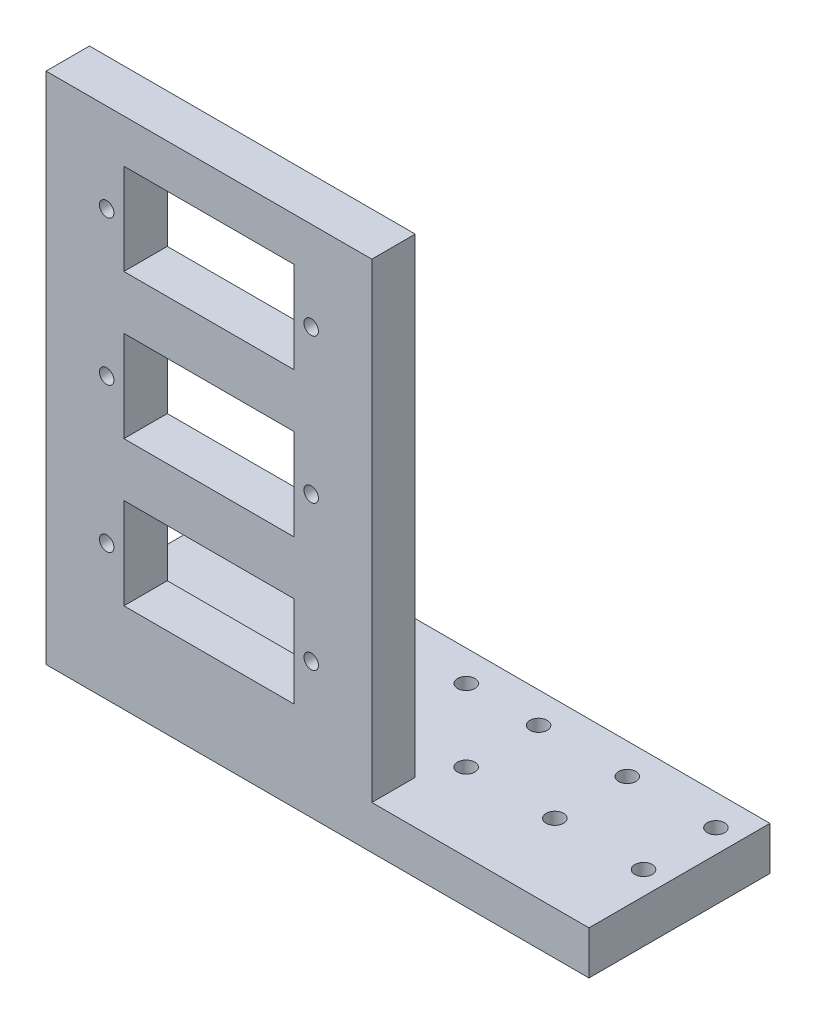
ISO-10303-21;
HEADER;
FILE_DESCRIPTION(('STEP AP214'),'2;1');
FILE_NAME('part.step','',(''),(''),'','','');
FILE_SCHEMA(('AUTOMOTIVE_DESIGN { 1 0 10303 214 1 1 1 1 }'));
ENDSEC;
DATA;
#1=APPLICATION_CONTEXT('core data for automotive mechanical design processes');
#2=APPLICATION_PROTOCOL_DEFINITION('international standard','automotive_design',2000,#1);
#3=PRODUCT_CONTEXT('',#1,'mechanical');
#4=PRODUCT('Part','Part','',(#3));
#5=PRODUCT_RELATED_PRODUCT_CATEGORY('part','',(#4));
#6=PRODUCT_DEFINITION_FORMATION('','',#4);
#7=PRODUCT_DEFINITION_CONTEXT('part definition',#1,'design');
#8=PRODUCT_DEFINITION('design','',#6,#7);
#9=PRODUCT_DEFINITION_SHAPE('','',#8);
#10=(LENGTH_UNIT() NAMED_UNIT(*) SI_UNIT(.MILLI.,.METRE.));
#11=(NAMED_UNIT(*) PLANE_ANGLE_UNIT() SI_UNIT($,.RADIAN.));
#12=(NAMED_UNIT(*) SI_UNIT($,.STERADIAN.) SOLID_ANGLE_UNIT());
#13=UNCERTAINTY_MEASURE_WITH_UNIT(LENGTH_MEASURE(1.E-05),#10,'distance_accuracy_value','');
#14=(GEOMETRIC_REPRESENTATION_CONTEXT(3) GLOBAL_UNCERTAINTY_ASSIGNED_CONTEXT((#13)) GLOBAL_UNIT_ASSIGNED_CONTEXT((#10,
#11,#12)) REPRESENTATION_CONTEXT('',''));
#15=CARTESIAN_POINT('',(0.,0.,0.));
#16=DIRECTION('',(0.,0.,1.));
#17=DIRECTION('',(1.,0.,0.));
#18=AXIS2_PLACEMENT_3D('',#15,#16,#17);
#19=CARTESIAN_POINT('',(45.,65.,0.));
#20=DIRECTION('',(-1.,0.,0.));
#21=DIRECTION('',(0.,0.,1.));
#22=AXIS2_PLACEMENT_3D('',#19,#20,#21);
#23=PLANE('',#22);
#24=DIRECTION('',(0.,0.,1.));
#25=VECTOR('',#24,1.);
#26=CARTESIAN_POINT('',(45.,0.,-25.));
#27=LINE('',#26,#25);
#28=CARTESIAN_POINT('',(45.,0.,-6.));
#29=VERTEX_POINT('',#28);
#30=CARTESIAN_POINT('',(45.,0.,0.));
#31=VERTEX_POINT('',#30);
#32=EDGE_CURVE('E11',#29,#31,#27,.T.);
#33=ORIENTED_EDGE('',*,*,#32,.F.);
#34=DIRECTION('',(0.,-1.,0.));
#35=VECTOR('',#34,1.);
#36=CARTESIAN_POINT('',(45.,65.,-6.));
#37=LINE('',#36,#35);
#38=CARTESIAN_POINT('',(45.,65.,-6.));
#39=VERTEX_POINT('',#38);
#40=EDGE_CURVE('E374',#39,#29,#37,.T.);
#41=ORIENTED_EDGE('',*,*,#40,.F.);
#42=DIRECTION('',(0.,0.,-1.));
#43=VECTOR('',#42,1.);
#44=CARTESIAN_POINT('',(45.,65.,0.));
#45=LINE('',#44,#43);
#46=CARTESIAN_POINT('',(45.,65.,0.));
#47=VERTEX_POINT('',#46);
#48=EDGE_CURVE('E361',#47,#39,#45,.T.);
#49=ORIENTED_EDGE('',*,*,#48,.F.);
#50=DIRECTION('',(0.,-1.,0.));
#51=VECTOR('',#50,1.);
#52=CARTESIAN_POINT('',(45.,65.,0.));
#53=LINE('',#52,#51);
#54=EDGE_CURVE('E378',#47,#31,#53,.T.);
#55=ORIENTED_EDGE('',*,*,#54,.T.);
#56=EDGE_LOOP('',(#33,#41,#49,#55));
#57=FACE_BOUND('',#56,.T.);
#58=ADVANCED_FACE('F40',(#57),#23,.F.);
#59=CARTESIAN_POINT('',(8.375,12.7,-6.));
#60=DIRECTION('',(0.,0.,1.));
#61=DIRECTION('',(1.,0.,0.));
#62=AXIS2_PLACEMENT_3D('',#59,#60,#61);
#63=CYLINDRICAL_SURFACE('',#62,1.);
#64=CARTESIAN_POINT('',(8.375,12.7,-6.));
#65=DIRECTION('',(0.,0.,1.));
#66=DIRECTION('',(1.,0.,0.));
#67=AXIS2_PLACEMENT_3D('',#64,#65,#66);
#68=CIRCLE('',#67,1.);
#69=CARTESIAN_POINT('',(9.375,12.7,-6.));
#70=VERTEX_POINT('',#69);
#71=EDGE_CURVE('E432',#70,#70,#68,.T.);
#72=ORIENTED_EDGE('',*,*,#71,.F.);
#73=EDGE_LOOP('',(#72));
#74=FACE_BOUND('',#73,.T.);
#75=CARTESIAN_POINT('',(8.375,12.7,0.));
#76=DIRECTION('',(0.,0.,1.));
#77=DIRECTION('',(1.,0.,0.));
#78=AXIS2_PLACEMENT_3D('',#75,#76,#77);
#79=CIRCLE('',#78,1.);
#80=CARTESIAN_POINT('',(9.375,12.7,0.));
#81=VERTEX_POINT('',#80);
#82=EDGE_CURVE('E50',#81,#81,#79,.T.);
#83=ORIENTED_EDGE('',*,*,#82,.T.);
#84=EDGE_LOOP('',(#83));
#85=FACE_BOUND('',#84,.T.);
#86=ADVANCED_FACE('F42',(#74,#85),#63,.F.);
#87=CARTESIAN_POINT('',(10.75,6.4,-6.));
#88=DIRECTION('',(0.,-1.,0.));
#89=DIRECTION('',(0.,0.,-1.));
#90=AXIS2_PLACEMENT_3D('',#87,#88,#89);
#91=PLANE('',#90);
#92=DIRECTION('',(1.,0.,0.));
#93=VECTOR('',#92,1.);
#94=CARTESIAN_POINT('',(10.75,6.4,0.));
#95=LINE('',#94,#93);
#96=CARTESIAN_POINT('',(10.75,6.4,0.));
#97=VERTEX_POINT('',#96);
#98=CARTESIAN_POINT('',(34.25,6.4,0.));
#99=VERTEX_POINT('',#98);
#100=EDGE_CURVE('E403',#97,#99,#95,.T.);
#101=ORIENTED_EDGE('',*,*,#100,.T.);
#102=DIRECTION('',(0.,0.,1.));
#103=VECTOR('',#102,1.);
#104=CARTESIAN_POINT('',(34.25,6.4,-6.));
#105=LINE('',#104,#103);
#106=CARTESIAN_POINT('',(34.25,6.4,-6.));
#107=VERTEX_POINT('',#106);
#108=EDGE_CURVE('E428',#107,#99,#105,.T.);
#109=ORIENTED_EDGE('',*,*,#108,.F.);
#110=DIRECTION('',(1.,0.,0.));
#111=VECTOR('',#110,1.);
#112=CARTESIAN_POINT('',(10.75,6.4,-6.));
#113=LINE('',#112,#111);
#114=CARTESIAN_POINT('',(10.75,6.4,-6.));
#115=VERTEX_POINT('',#114);
#116=EDGE_CURVE('E409',#115,#107,#113,.T.);
#117=ORIENTED_EDGE('',*,*,#116,.F.);
#118=DIRECTION('',(0.,0.,1.));
#119=VECTOR('',#118,1.);
#120=CARTESIAN_POINT('',(10.75,6.4,-6.));
#121=LINE('',#120,#119);
#122=EDGE_CURVE('E417',#115,#97,#121,.T.);
#123=ORIENTED_EDGE('',*,*,#122,.T.);
#124=EDGE_LOOP('',(#101,#109,#117,#123));
#125=FACE_BOUND('',#124,.T.);
#126=ADVANCED_FACE('F491',(#125),#91,.F.);
#127=CARTESIAN_POINT('',(34.25,19.,-6.));
#128=DIRECTION('',(1.,0.,0.));
#129=DIRECTION('',(0.,1.,0.));
#130=AXIS2_PLACEMENT_3D('',#127,#128,#129);
#131=PLANE('',#130);
#132=DIRECTION('',(0.,1.,0.));
#133=VECTOR('',#132,1.);
#134=CARTESIAN_POINT('',(34.25,19.,0.));
#135=LINE('',#134,#133);
#136=CARTESIAN_POINT('',(34.25,19.,0.));
#137=VERTEX_POINT('',#136);
#138=EDGE_CURVE('E399',#99,#137,#135,.T.);
#139=ORIENTED_EDGE('',*,*,#138,.T.);
#140=DIRECTION('',(0.,0.,1.));
#141=VECTOR('',#140,1.);
#142=CARTESIAN_POINT('',(34.25,19.,-6.));
#143=LINE('',#142,#141);
#144=CARTESIAN_POINT('',(34.25,19.,-6.));
#145=VERTEX_POINT('',#144);
#146=EDGE_CURVE('E424',#145,#137,#143,.T.);
#147=ORIENTED_EDGE('',*,*,#146,.F.);
#148=DIRECTION('',(0.,1.,0.));
#149=VECTOR('',#148,1.);
#150=CARTESIAN_POINT('',(34.25,19.,-6.));
#151=LINE('',#150,#149);
#152=EDGE_CURVE('E65',#107,#145,#151,.T.);
#153=ORIENTED_EDGE('',*,*,#152,.F.);
#154=ORIENTED_EDGE('',*,*,#108,.T.);
#155=EDGE_LOOP('',(#139,#147,#153,#154));
#156=FACE_BOUND('',#155,.T.);
#157=ADVANCED_FACE('F515',(#156),#131,.F.);
#158=CARTESIAN_POINT('',(10.75,19.,-6.));
#159=DIRECTION('',(0.,1.,0.));
#160=DIRECTION('',(0.,0.,1.));
#161=AXIS2_PLACEMENT_3D('',#158,#159,#160);
#162=PLANE('',#161);
#163=DIRECTION('',(-1.,0.,0.));
#164=VECTOR('',#163,1.);
#165=CARTESIAN_POINT('',(10.75,19.,0.));
#166=LINE('',#165,#164);
#167=CARTESIAN_POINT('',(10.75,19.,0.));
#168=VERTEX_POINT('',#167);
#169=EDGE_CURVE('E395',#137,#168,#166,.T.);
#170=ORIENTED_EDGE('',*,*,#169,.T.);
#171=DIRECTION('',(0.,0.,1.));
#172=VECTOR('',#171,1.);
#173=CARTESIAN_POINT('',(10.75,19.,-6.));
#174=LINE('',#173,#172);
#175=CARTESIAN_POINT('',(10.75,19.,-6.));
#176=VERTEX_POINT('',#175);
#177=EDGE_CURVE('E421',#176,#168,#174,.T.);
#178=ORIENTED_EDGE('',*,*,#177,.F.);
#179=DIRECTION('',(-1.,0.,0.));
#180=VECTOR('',#179,1.);
#181=CARTESIAN_POINT('',(10.75,19.,-6.));
#182=LINE('',#181,#180);
#183=EDGE_CURVE('E414',#145,#176,#182,.T.);
#184=ORIENTED_EDGE('',*,*,#183,.F.);
#185=ORIENTED_EDGE('',*,*,#146,.T.);
#186=EDGE_LOOP('',(#170,#178,#184,#185));
#187=FACE_BOUND('',#186,.T.);
#188=ADVANCED_FACE('F512',(#187),#162,.F.);
#189=CARTESIAN_POINT('',(10.75,19.,-6.));
#190=DIRECTION('',(-1.,0.,0.));
#191=DIRECTION('',(0.,-1.,0.));
#192=AXIS2_PLACEMENT_3D('',#189,#190,#191);
#193=PLANE('',#192);
#194=DIRECTION('',(0.,-1.,0.));
#195=VECTOR('',#194,1.);
#196=CARTESIAN_POINT('',(10.75,19.,0.));
#197=LINE('',#196,#195);
#198=EDGE_CURVE('E392',#168,#97,#197,.T.);
#199=ORIENTED_EDGE('',*,*,#198,.T.);
#200=ORIENTED_EDGE('',*,*,#122,.F.);
#201=DIRECTION('',(0.,-1.,0.));
#202=VECTOR('',#201,1.);
#203=CARTESIAN_POINT('',(10.75,19.,-6.));
#204=LINE('',#203,#202);
#205=EDGE_CURVE('E58',#176,#115,#204,.T.);
#206=ORIENTED_EDGE('',*,*,#205,.F.);
#207=ORIENTED_EDGE('',*,*,#177,.T.);
#208=EDGE_LOOP('',(#199,#200,#206,#207));
#209=FACE_BOUND('',#208,.T.);
#210=ADVANCED_FACE('F508',(#209),#193,.F.);
#211=CARTESIAN_POINT('',(36.625,12.7,-6.));
#212=DIRECTION('',(0.,0.,1.));
#213=DIRECTION('',(1.,0.,0.));
#214=AXIS2_PLACEMENT_3D('',#211,#212,#213);
#215=CYLINDRICAL_SURFACE('',#214,0.999999999999998);
#216=CARTESIAN_POINT('',(36.625,12.7,-6.));
#217=DIRECTION('',(0.,0.,1.));
#218=DIRECTION('',(1.,0.,0.));
#219=AXIS2_PLACEMENT_3D('',#216,#217,#218);
#220=CIRCLE('',#219,0.999999999999998);
#221=CARTESIAN_POINT('',(37.625,12.7,-6.));
#222=VERTEX_POINT('',#221);
#223=EDGE_CURVE('E384',#222,#222,#220,.T.);
#224=ORIENTED_EDGE('',*,*,#223,.F.);
#225=EDGE_LOOP('',(#224));
#226=FACE_BOUND('',#225,.T.);
#227=CARTESIAN_POINT('',(36.625,12.7,0.));
#228=DIRECTION('',(0.,0.,1.));
#229=DIRECTION('',(1.,0.,0.));
#230=AXIS2_PLACEMENT_3D('',#227,#228,#229);
#231=CIRCLE('',#230,0.999999999999998);
#232=CARTESIAN_POINT('',(37.625,12.7,0.));
#233=VERTEX_POINT('',#232);
#234=EDGE_CURVE('E388',#233,#233,#231,.T.);
#235=ORIENTED_EDGE('',*,*,#234,.T.);
#236=EDGE_LOOP('',(#235));
#237=FACE_BOUND('',#236,.T.);
#238=ADVANCED_FACE('F504',(#226,#237),#215,.F.);
#239=CARTESIAN_POINT('',(0.,65.,0.));
#240=DIRECTION('',(1.,0.,0.));
#241=DIRECTION('',(0.,0.,-1.));
#242=AXIS2_PLACEMENT_3D('',#239,#240,#241);
#243=PLANE('',#242);
#244=DIRECTION('',(0.,-1.,0.));
#245=VECTOR('',#244,1.);
#246=CARTESIAN_POINT('',(0.,65.,-6.));
#247=LINE('',#246,#245);
#248=CARTESIAN_POINT('',(0.,65.,-6.));
#249=VERTEX_POINT('',#248);
#250=CARTESIAN_POINT('',(0.,0.,-6.));
#251=VERTEX_POINT('',#250);
#252=EDGE_CURVE('E367',#249,#251,#247,.T.);
#253=ORIENTED_EDGE('',*,*,#252,.T.);
#254=DIRECTION('',(0.,0.,-1.));
#255=VECTOR('',#254,1.);
#256=CARTESIAN_POINT('',(0.,0.,0.));
#257=LINE('',#256,#255);
#258=CARTESIAN_POINT('',(0.,0.,-25.));
#259=VERTEX_POINT('',#258);
#260=EDGE_CURVE('E186',#251,#259,#257,.T.);
#261=ORIENTED_EDGE('',*,*,#260,.T.);
#262=DIRECTION('',(0.,1.,0.));
#263=VECTOR('',#262,1.);
#264=CARTESIAN_POINT('',(0.,-6.,-25.));
#265=LINE('',#264,#263);
#266=CARTESIAN_POINT('',(0.,-6.,-25.));
#267=VERTEX_POINT('',#266);
#268=EDGE_CURVE('E182',#267,#259,#265,.T.);
#269=ORIENTED_EDGE('',*,*,#268,.F.);
#270=DIRECTION('',(0.,0.,-1.));
#271=VECTOR('',#270,1.);
#272=CARTESIAN_POINT('',(0.,-6.,0.));
#273=LINE('',#272,#271);
#274=CARTESIAN_POINT('',(0.,-6.,0.));
#275=VERTEX_POINT('',#274);
#276=EDGE_CURVE('E185',#275,#267,#273,.T.);
#277=ORIENTED_EDGE('',*,*,#276,.F.);
#278=DIRECTION('',(0.,-1.,0.));
#279=VECTOR('',#278,1.);
#280=CARTESIAN_POINT('',(0.,65.,0.));
#281=LINE('',#280,#279);
#282=CARTESIAN_POINT('',(0.,65.,0.));
#283=VERTEX_POINT('',#282);
#284=EDGE_CURVE('E381',#283,#275,#281,.T.);
#285=ORIENTED_EDGE('',*,*,#284,.F.);
#286=DIRECTION('',(0.,0.,1.));
#287=VECTOR('',#286,1.);
#288=CARTESIAN_POINT('',(0.,65.,0.));
#289=LINE('',#288,#287);
#290=EDGE_CURVE('E354',#249,#283,#289,.T.);
#291=ORIENTED_EDGE('',*,*,#290,.F.);
#292=EDGE_LOOP('',(#253,#261,#269,#277,#285,#291));
#293=FACE_BOUND('',#292,.T.);
#294=ADVANCED_FACE('F500',(#293),#243,.F.);
#295=CARTESIAN_POINT('',(0.,65.,0.));
#296=DIRECTION('',(0.,0.,-1.));
#297=DIRECTION('',(-1.,0.,0.));
#298=AXIS2_PLACEMENT_3D('',#295,#296,#297);
#299=PLANE('',#298);
#300=CARTESIAN_POINT('',(8.375,32.7,0.));
#301=DIRECTION('',(0.,0.,1.));
#302=DIRECTION('',(1.,0.,0.));
#303=AXIS2_PLACEMENT_3D('',#300,#301,#302);
#304=CIRCLE('',#303,1.);
#305=CARTESIAN_POINT('',(9.375,32.7,0.));
#306=VERTEX_POINT('',#305);
#307=EDGE_CURVE('E237',#306,#306,#304,.T.);
#308=ORIENTED_EDGE('',*,*,#307,.F.);
#309=EDGE_LOOP('',(#308));
#310=FACE_BOUND('',#309,.T.);
#311=DIRECTION('',(1.,0.,0.));
#312=VECTOR('',#311,1.);
#313=CARTESIAN_POINT('',(10.75,26.4,0.));
#314=LINE('',#313,#312);
#315=CARTESIAN_POINT('',(10.75,26.4,0.));
#316=VERTEX_POINT('',#315);
#317=CARTESIAN_POINT('',(34.25,26.4,0.));
#318=VERTEX_POINT('',#317);
#319=EDGE_CURVE('E241',#316,#318,#314,.T.);
#320=ORIENTED_EDGE('',*,*,#319,.F.);
#321=DIRECTION('',(0.,-1.,0.));
#322=VECTOR('',#321,1.);
#323=CARTESIAN_POINT('',(10.75,39.,0.));
#324=LINE('',#323,#322);
#325=CARTESIAN_POINT('',(10.75,39.,0.));
#326=VERTEX_POINT('',#325);
#327=EDGE_CURVE('E278',#326,#316,#324,.T.);
#328=ORIENTED_EDGE('',*,*,#327,.F.);
#329=DIRECTION('',(-1.,0.,0.));
#330=VECTOR('',#329,1.);
#331=CARTESIAN_POINT('',(10.75,39.,0.));
#332=LINE('',#331,#330);
#333=CARTESIAN_POINT('',(34.25,39.,0.));
#334=VERTEX_POINT('',#333);
#335=EDGE_CURVE('E267',#334,#326,#332,.T.);
#336=ORIENTED_EDGE('',*,*,#335,.F.);
#337=DIRECTION('',(0.,1.,0.));
#338=VECTOR('',#337,1.);
#339=CARTESIAN_POINT('',(34.25,39.,0.));
#340=LINE('',#339,#338);
#341=EDGE_CURVE('E256',#318,#334,#340,.T.);
#342=ORIENTED_EDGE('',*,*,#341,.F.);
#343=EDGE_LOOP('',(#320,#328,#336,#342));
#344=FACE_BOUND('',#343,.T.);
#345=CARTESIAN_POINT('',(36.625,32.7,0.));
#346=DIRECTION('',(0.,0.,1.));
#347=DIRECTION('',(1.,0.,0.));
#348=AXIS2_PLACEMENT_3D('',#345,#346,#347);
#349=CIRCLE('',#348,0.999999999999998);
#350=CARTESIAN_POINT('',(37.625,32.7,0.));
#351=VERTEX_POINT('',#350);
#352=EDGE_CURVE('E289',#351,#351,#349,.T.);
#353=ORIENTED_EDGE('',*,*,#352,.F.);
#354=EDGE_LOOP('',(#353));
#355=FACE_BOUND('',#354,.T.);
#356=CARTESIAN_POINT('',(36.625,52.7,0.));
#357=DIRECTION('',(0.,0.,1.));
#358=DIRECTION('',(1.,0.,0.));
#359=AXIS2_PLACEMENT_3D('',#356,#357,#358);
#360=CIRCLE('',#359,0.999999999999998);
#361=CARTESIAN_POINT('',(37.625,52.7,0.));
#362=VERTEX_POINT('',#361);
#363=EDGE_CURVE('E293',#362,#362,#360,.T.);
#364=ORIENTED_EDGE('',*,*,#363,.F.);
#365=EDGE_LOOP('',(#364));
#366=FACE_BOUND('',#365,.T.);
#367=CARTESIAN_POINT('',(8.375,52.7,0.));
#368=DIRECTION('',(0.,0.,1.));
#369=DIRECTION('',(1.,0.,0.));
#370=AXIS2_PLACEMENT_3D('',#367,#368,#369);
#371=CIRCLE('',#370,1.);
#372=CARTESIAN_POINT('',(9.375,52.7,0.));
#373=VERTEX_POINT('',#372);
#374=EDGE_CURVE('E299',#373,#373,#371,.T.);
#375=ORIENTED_EDGE('',*,*,#374,.F.);
#376=EDGE_LOOP('',(#375));
#377=FACE_BOUND('',#376,.T.);
#378=DIRECTION('',(1.,0.,0.));
#379=VECTOR('',#378,1.);
#380=CARTESIAN_POINT('',(10.75,46.4,0.));
#381=LINE('',#380,#379);
#382=CARTESIAN_POINT('',(10.75,46.4,0.));
#383=VERTEX_POINT('',#382);
#384=CARTESIAN_POINT('',(34.25,46.4,0.));
#385=VERTEX_POINT('',#384);
#386=EDGE_CURVE('E330',#383,#385,#381,.T.);
#387=ORIENTED_EDGE('',*,*,#386,.F.);
#388=DIRECTION('',(0.,-1.,0.));
#389=VECTOR('',#388,1.);
#390=CARTESIAN_POINT('',(10.75,59.,0.));
#391=LINE('',#390,#389);
#392=CARTESIAN_POINT('',(10.75,59.,0.));
#393=VERTEX_POINT('',#392);
#394=EDGE_CURVE('E298',#393,#383,#391,.T.);
#395=ORIENTED_EDGE('',*,*,#394,.F.);
#396=DIRECTION('',(-1.,0.,0.));
#397=VECTOR('',#396,1.);
#398=CARTESIAN_POINT('',(10.75,59.,0.));
#399=LINE('',#398,#397);
#400=CARTESIAN_POINT('',(34.25,59.,0.));
#401=VERTEX_POINT('',#400);
#402=EDGE_CURVE('E315',#401,#393,#399,.T.);
#403=ORIENTED_EDGE('',*,*,#402,.F.);
#404=DIRECTION('',(0.,1.,0.));
#405=VECTOR('',#404,1.);
#406=CARTESIAN_POINT('',(34.25,59.,0.));
#407=LINE('',#406,#405);
#408=EDGE_CURVE('E334',#385,#401,#407,.T.);
#409=ORIENTED_EDGE('',*,*,#408,.F.);
#410=EDGE_LOOP('',(#387,#395,#403,#409));
#411=FACE_BOUND('',#410,.T.);
#412=ORIENTED_EDGE('',*,*,#284,.T.);
#413=DIRECTION('',(-1.,0.,0.));
#414=VECTOR('',#413,1.);
#415=CARTESIAN_POINT('',(0.,-6.,0.));
#416=LINE('',#415,#414);
#417=CARTESIAN_POINT('',(75.,-6.,0.));
#418=VERTEX_POINT('',#417);
#419=EDGE_CURVE('E225',#418,#275,#416,.T.);
#420=ORIENTED_EDGE('',*,*,#419,.F.);
#421=DIRECTION('',(0.,-1.,0.));
#422=VECTOR('',#421,1.);
#423=CARTESIAN_POINT('',(75.,0.,0.));
#424=LINE('',#423,#422);
#425=CARTESIAN_POINT('',(75.,0.,0.));
#426=VERTEX_POINT('',#425);
#427=EDGE_CURVE('E198',#426,#418,#424,.T.);
#428=ORIENTED_EDGE('',*,*,#427,.F.);
#429=DIRECTION('',(-1.,0.,0.));
#430=VECTOR('',#429,1.);
#431=CARTESIAN_POINT('',(75.,0.,0.));
#432=LINE('',#431,#430);
#433=EDGE_CURVE('E193',#426,#31,#432,.T.);
#434=ORIENTED_EDGE('',*,*,#433,.T.);
#435=ORIENTED_EDGE('',*,*,#54,.F.);
#436=DIRECTION('',(1.,0.,0.));
#437=VECTOR('',#436,1.);
#438=CARTESIAN_POINT('',(0.,65.,0.));
#439=LINE('',#438,#437);
#440=EDGE_CURVE('E358',#283,#47,#439,.T.);
#441=ORIENTED_EDGE('',*,*,#440,.F.);
#442=EDGE_LOOP('',(#412,#420,#428,#434,#435,#441));
#443=FACE_BOUND('',#442,.T.);
#444=ORIENTED_EDGE('',*,*,#234,.F.);
#445=EDGE_LOOP('',(#444));
#446=FACE_BOUND('',#445,.T.);
#447=ORIENTED_EDGE('',*,*,#198,.F.);
#448=ORIENTED_EDGE('',*,*,#169,.F.);
#449=ORIENTED_EDGE('',*,*,#138,.F.);
#450=ORIENTED_EDGE('',*,*,#100,.F.);
#451=EDGE_LOOP('',(#447,#448,#449,#450));
#452=FACE_BOUND('',#451,.T.);
#453=ORIENTED_EDGE('',*,*,#82,.F.);
#454=EDGE_LOOP('',(#453));
#455=FACE_BOUND('',#454,.T.);
#456=ADVANCED_FACE('F497',(#310,#344,#355,#366,#377,#411,#443,#446,#452,#455),#299,.F.);
#457=CARTESIAN_POINT('',(0.,65.,-6.));
#458=DIRECTION('',(0.,0.,1.));
#459=DIRECTION('',(1.,0.,0.));
#460=AXIS2_PLACEMENT_3D('',#457,#458,#459);
#461=PLANE('',#460);
#462=CARTESIAN_POINT('',(8.375,32.7,-6.));
#463=DIRECTION('',(0.,0.,1.));
#464=DIRECTION('',(1.,0.,0.));
#465=AXIS2_PLACEMENT_3D('',#462,#463,#464);
#466=CIRCLE('',#465,1.);
#467=CARTESIAN_POINT('',(9.375,32.7,-6.));
#468=VERTEX_POINT('',#467);
#469=EDGE_CURVE('E233',#468,#468,#466,.T.);
#470=ORIENTED_EDGE('',*,*,#469,.T.);
#471=EDGE_LOOP('',(#470));
#472=FACE_BOUND('',#471,.T.);
#473=DIRECTION('',(-1.,0.,0.));
#474=VECTOR('',#473,1.);
#475=CARTESIAN_POINT('',(10.75,39.,-6.));
#476=LINE('',#475,#474);
#477=CARTESIAN_POINT('',(34.25,39.,-6.));
#478=VERTEX_POINT('',#477);
#479=CARTESIAN_POINT('',(10.75,39.,-6.));
#480=VERTEX_POINT('',#479);
#481=EDGE_CURVE('E274',#478,#480,#476,.T.);
#482=ORIENTED_EDGE('',*,*,#481,.T.);
#483=DIRECTION('',(0.,-1.,0.));
#484=VECTOR('',#483,1.);
#485=CARTESIAN_POINT('',(10.75,39.,-6.));
#486=LINE('',#485,#484);
#487=CARTESIAN_POINT('',(10.75,26.4,-6.));
#488=VERTEX_POINT('',#487);
#489=EDGE_CURVE('E281',#480,#488,#486,.T.);
#490=ORIENTED_EDGE('',*,*,#489,.T.);
#491=DIRECTION('',(1.,0.,0.));
#492=VECTOR('',#491,1.);
#493=CARTESIAN_POINT('',(10.75,26.4,-6.));
#494=LINE('',#493,#492);
#495=CARTESIAN_POINT('',(34.25,26.4,-6.));
#496=VERTEX_POINT('',#495);
#497=EDGE_CURVE('E244',#488,#496,#494,.T.);
#498=ORIENTED_EDGE('',*,*,#497,.T.);
#499=DIRECTION('',(0.,1.,0.));
#500=VECTOR('',#499,1.);
#501=CARTESIAN_POINT('',(34.25,39.,-6.));
#502=LINE('',#501,#500);
#503=EDGE_CURVE('E263',#496,#478,#502,.T.);
#504=ORIENTED_EDGE('',*,*,#503,.T.);
#505=EDGE_LOOP('',(#482,#490,#498,#504));
#506=FACE_BOUND('',#505,.T.);
#507=CARTESIAN_POINT('',(36.625,32.7,-6.));
#508=DIRECTION('',(0.,0.,1.));
#509=DIRECTION('',(1.,0.,0.));
#510=AXIS2_PLACEMENT_3D('',#507,#508,#509);
#511=CIRCLE('',#510,0.999999999999998);
#512=CARTESIAN_POINT('',(37.625,32.7,-6.));
#513=VERTEX_POINT('',#512);
#514=EDGE_CURVE('E285',#513,#513,#511,.T.);
#515=ORIENTED_EDGE('',*,*,#514,.T.);
#516=EDGE_LOOP('',(#515));
#517=FACE_BOUND('',#516,.T.);
#518=CARTESIAN_POINT('',(36.625,52.7,-6.));
#519=DIRECTION('',(0.,0.,1.));
#520=DIRECTION('',(1.,0.,0.));
#521=AXIS2_PLACEMENT_3D('',#518,#519,#520);
#522=CIRCLE('',#521,0.999999999999998);
#523=CARTESIAN_POINT('',(37.625,52.7,-6.));
#524=VERTEX_POINT('',#523);
#525=EDGE_CURVE('E303',#524,#524,#522,.T.);
#526=ORIENTED_EDGE('',*,*,#525,.T.);
#527=EDGE_LOOP('',(#526));
#528=FACE_BOUND('',#527,.T.);
#529=CARTESIAN_POINT('',(8.375,52.7,-6.));
#530=DIRECTION('',(0.,0.,1.));
#531=DIRECTION('',(1.,0.,0.));
#532=AXIS2_PLACEMENT_3D('',#529,#530,#531);
#533=CIRCLE('',#532,1.);
#534=CARTESIAN_POINT('',(9.375,52.7,-6.));
#535=VERTEX_POINT('',#534);
#536=EDGE_CURVE('E294',#535,#535,#533,.T.);
#537=ORIENTED_EDGE('',*,*,#536,.T.);
#538=EDGE_LOOP('',(#537));
#539=FACE_BOUND('',#538,.T.);
#540=DIRECTION('',(-1.,0.,0.));
#541=VECTOR('',#540,1.);
#542=CARTESIAN_POINT('',(10.75,59.,-6.));
#543=LINE('',#542,#541);
#544=CARTESIAN_POINT('',(34.25,59.,-6.));
#545=VERTEX_POINT('',#544);
#546=CARTESIAN_POINT('',(10.75,59.,-6.));
#547=VERTEX_POINT('',#546);
#548=EDGE_CURVE('E323',#545,#547,#543,.T.);
#549=ORIENTED_EDGE('',*,*,#548,.T.);
#550=DIRECTION('',(0.,-1.,0.));
#551=VECTOR('',#550,1.);
#552=CARTESIAN_POINT('',(10.75,59.,-6.));
#553=LINE('',#552,#551);
#554=CARTESIAN_POINT('',(10.75,46.4,-6.));
#555=VERTEX_POINT('',#554);
#556=EDGE_CURVE('E310',#547,#555,#553,.T.);
#557=ORIENTED_EDGE('',*,*,#556,.T.);
#558=DIRECTION('',(1.,0.,0.));
#559=VECTOR('',#558,1.);
#560=CARTESIAN_POINT('',(10.75,46.4,-6.));
#561=LINE('',#560,#559);
#562=CARTESIAN_POINT('',(34.25,46.4,-6.));
#563=VERTEX_POINT('',#562);
#564=EDGE_CURVE('E314',#555,#563,#561,.T.);
#565=ORIENTED_EDGE('',*,*,#564,.T.);
#566=DIRECTION('',(0.,1.,0.));
#567=VECTOR('',#566,1.);
#568=CARTESIAN_POINT('',(34.25,59.,-6.));
#569=LINE('',#568,#567);
#570=EDGE_CURVE('E319',#563,#545,#569,.T.);
#571=ORIENTED_EDGE('',*,*,#570,.T.);
#572=EDGE_LOOP('',(#549,#557,#565,#571));
#573=FACE_BOUND('',#572,.T.);
#574=DIRECTION('',(-1.,0.,0.));
#575=VECTOR('',#574,1.);
#576=CARTESIAN_POINT('',(0.,0.,-6.));
#577=LINE('',#576,#575);
#578=EDGE_CURVE('E344',#29,#251,#577,.T.);
#579=ORIENTED_EDGE('',*,*,#578,.T.);
#580=ORIENTED_EDGE('',*,*,#252,.F.);
#581=DIRECTION('',(-1.,0.,0.));
#582=VECTOR('',#581,1.);
#583=CARTESIAN_POINT('',(0.,65.,-6.));
#584=LINE('',#583,#582);
#585=EDGE_CURVE('E364',#39,#249,#584,.T.);
#586=ORIENTED_EDGE('',*,*,#585,.F.);
#587=ORIENTED_EDGE('',*,*,#40,.T.);
#588=EDGE_LOOP('',(#579,#580,#586,#587));
#589=FACE_BOUND('',#588,.T.);
#590=ORIENTED_EDGE('',*,*,#223,.T.);
#591=EDGE_LOOP('',(#590));
#592=FACE_BOUND('',#591,.T.);
#593=ORIENTED_EDGE('',*,*,#205,.T.);
#594=ORIENTED_EDGE('',*,*,#116,.T.);
#595=ORIENTED_EDGE('',*,*,#152,.T.);
#596=ORIENTED_EDGE('',*,*,#183,.T.);
#597=EDGE_LOOP('',(#593,#594,#595,#596));
#598=FACE_BOUND('',#597,.T.);
#599=ORIENTED_EDGE('',*,*,#71,.T.);
#600=EDGE_LOOP('',(#599));
#601=FACE_BOUND('',#600,.T.);
#602=ADVANCED_FACE('F495',(#472,#506,#517,#528,#539,#573,#589,#592,#598,#601),#461,.F.);
#603=CARTESIAN_POINT('',(0.,65.,0.));
#604=DIRECTION('',(0.,-1.,0.));
#605=DIRECTION('',(0.,0.,-1.));
#606=AXIS2_PLACEMENT_3D('',#603,#604,#605);
#607=PLANE('',#606);
#608=ORIENTED_EDGE('',*,*,#290,.T.);
#609=ORIENTED_EDGE('',*,*,#440,.T.);
#610=ORIENTED_EDGE('',*,*,#48,.T.);
#611=ORIENTED_EDGE('',*,*,#585,.T.);
#612=EDGE_LOOP('',(#608,#609,#610,#611));
#613=FACE_BOUND('',#612,.T.);
#614=ADVANCED_FACE('F534',(#613),#607,.F.);
#615=CARTESIAN_POINT('',(10.75,59.,-6.));
#616=DIRECTION('',(-1.,0.,0.));
#617=DIRECTION('',(0.,-1.,0.));
#618=AXIS2_PLACEMENT_3D('',#615,#616,#617);
#619=PLANE('',#618);
#620=ORIENTED_EDGE('',*,*,#394,.T.);
#621=DIRECTION('',(0.,0.,1.));
#622=VECTOR('',#621,1.);
#623=CARTESIAN_POINT('',(10.75,46.4,-6.));
#624=LINE('',#623,#622);
#625=EDGE_CURVE('E327',#555,#383,#624,.T.);
#626=ORIENTED_EDGE('',*,*,#625,.F.);
#627=ORIENTED_EDGE('',*,*,#556,.F.);
#628=DIRECTION('',(0.,0.,1.));
#629=VECTOR('',#628,1.);
#630=CARTESIAN_POINT('',(10.75,59.,-6.));
#631=LINE('',#630,#629);
#632=EDGE_CURVE('E341',#547,#393,#631,.T.);
#633=ORIENTED_EDGE('',*,*,#632,.T.);
#634=EDGE_LOOP('',(#620,#626,#627,#633));
#635=FACE_BOUND('',#634,.T.);
#636=ADVANCED_FACE('F540',(#635),#619,.F.);
#637=CARTESIAN_POINT('',(10.75,59.,-6.));
#638=DIRECTION('',(0.,1.,0.));
#639=DIRECTION('',(0.,0.,1.));
#640=AXIS2_PLACEMENT_3D('',#637,#638,#639);
#641=PLANE('',#640);
#642=ORIENTED_EDGE('',*,*,#402,.T.);
#643=ORIENTED_EDGE('',*,*,#632,.F.);
#644=ORIENTED_EDGE('',*,*,#548,.F.);
#645=DIRECTION('',(0.,0.,1.));
#646=VECTOR('',#645,1.);
#647=CARTESIAN_POINT('',(34.25,59.,-6.));
#648=LINE('',#647,#646);
#649=EDGE_CURVE('E345',#545,#401,#648,.T.);
#650=ORIENTED_EDGE('',*,*,#649,.T.);
#651=EDGE_LOOP('',(#642,#643,#644,#650));
#652=FACE_BOUND('',#651,.T.);
#653=ADVANCED_FACE('F618',(#652),#641,.F.);
#654=CARTESIAN_POINT('',(34.25,59.,-6.));
#655=DIRECTION('',(1.,0.,0.));
#656=DIRECTION('',(0.,1.,0.));
#657=AXIS2_PLACEMENT_3D('',#654,#655,#656);
#658=PLANE('',#657);
#659=ORIENTED_EDGE('',*,*,#408,.T.);
#660=ORIENTED_EDGE('',*,*,#649,.F.);
#661=ORIENTED_EDGE('',*,*,#570,.F.);
#662=DIRECTION('',(0.,0.,1.));
#663=VECTOR('',#662,1.);
#664=CARTESIAN_POINT('',(34.25,46.4,-6.));
#665=LINE('',#664,#663);
#666=EDGE_CURVE('E348',#563,#385,#665,.T.);
#667=ORIENTED_EDGE('',*,*,#666,.T.);
#668=EDGE_LOOP('',(#659,#660,#661,#667));
#669=FACE_BOUND('',#668,.T.);
#670=ADVANCED_FACE('F621',(#669),#658,.F.);
#671=CARTESIAN_POINT('',(10.75,46.4,-6.));
#672=DIRECTION('',(0.,-1.,0.));
#673=DIRECTION('',(0.,0.,-1.));
#674=AXIS2_PLACEMENT_3D('',#671,#672,#673);
#675=PLANE('',#674);
#676=ORIENTED_EDGE('',*,*,#386,.T.);
#677=ORIENTED_EDGE('',*,*,#666,.F.);
#678=ORIENTED_EDGE('',*,*,#564,.F.);
#679=ORIENTED_EDGE('',*,*,#625,.T.);
#680=EDGE_LOOP('',(#676,#677,#678,#679));
#681=FACE_BOUND('',#680,.T.);
#682=ADVANCED_FACE('F613',(#681),#675,.F.);
#683=CARTESIAN_POINT('',(8.375,52.7,-6.));
#684=DIRECTION('',(0.,0.,1.));
#685=DIRECTION('',(1.,0.,0.));
#686=AXIS2_PLACEMENT_3D('',#683,#684,#685);
#687=CYLINDRICAL_SURFACE('',#686,1.);
#688=ORIENTED_EDGE('',*,*,#536,.F.);
#689=EDGE_LOOP('',(#688));
#690=FACE_BOUND('',#689,.T.);
#691=ORIENTED_EDGE('',*,*,#374,.T.);
#692=EDGE_LOOP('',(#691));
#693=FACE_BOUND('',#692,.T.);
#694=ADVANCED_FACE('F610',(#690,#693),#687,.F.);
#695=CARTESIAN_POINT('',(36.625,52.7,-6.));
#696=DIRECTION('',(0.,0.,1.));
#697=DIRECTION('',(1.,0.,0.));
#698=AXIS2_PLACEMENT_3D('',#695,#696,#697);
#699=CYLINDRICAL_SURFACE('',#698,0.999999999999998);
#700=ORIENTED_EDGE('',*,*,#525,.F.);
#701=EDGE_LOOP('',(#700));
#702=FACE_BOUND('',#701,.T.);
#703=ORIENTED_EDGE('',*,*,#363,.T.);
#704=EDGE_LOOP('',(#703));
#705=FACE_BOUND('',#704,.T.);
#706=ADVANCED_FACE('F608',(#702,#705),#699,.F.);
#707=CARTESIAN_POINT('',(36.625,32.7,-6.));
#708=DIRECTION('',(0.,0.,1.));
#709=DIRECTION('',(1.,0.,0.));
#710=AXIS2_PLACEMENT_3D('',#707,#708,#709);
#711=CYLINDRICAL_SURFACE('',#710,0.999999999999998);
#712=ORIENTED_EDGE('',*,*,#514,.F.);
#713=EDGE_LOOP('',(#712));
#714=FACE_BOUND('',#713,.T.);
#715=ORIENTED_EDGE('',*,*,#352,.T.);
#716=EDGE_LOOP('',(#715));
#717=FACE_BOUND('',#716,.T.);
#718=ADVANCED_FACE('F604',(#714,#717),#711,.F.);
#719=CARTESIAN_POINT('',(10.75,39.,-6.));
#720=DIRECTION('',(-1.,0.,0.));
#721=DIRECTION('',(0.,-1.,0.));
#722=AXIS2_PLACEMENT_3D('',#719,#720,#721);
#723=PLANE('',#722);
#724=ORIENTED_EDGE('',*,*,#327,.T.);
#725=DIRECTION('',(0.,0.,1.));
#726=VECTOR('',#725,1.);
#727=CARTESIAN_POINT('',(10.75,26.4,-6.));
#728=LINE('',#727,#726);
#729=EDGE_CURVE('E252',#488,#316,#728,.T.);
#730=ORIENTED_EDGE('',*,*,#729,.F.);
#731=ORIENTED_EDGE('',*,*,#489,.F.);
#732=DIRECTION('',(0.,0.,1.));
#733=VECTOR('',#732,1.);
#734=CARTESIAN_POINT('',(10.75,39.,-6.));
#735=LINE('',#734,#733);
#736=EDGE_CURVE('E270',#480,#326,#735,.T.);
#737=ORIENTED_EDGE('',*,*,#736,.T.);
#738=EDGE_LOOP('',(#724,#730,#731,#737));
#739=FACE_BOUND('',#738,.T.);
#740=ADVANCED_FACE('F600',(#739),#723,.F.);
#741=CARTESIAN_POINT('',(10.75,39.,-6.));
#742=DIRECTION('',(0.,1.,0.));
#743=DIRECTION('',(0.,0.,1.));
#744=AXIS2_PLACEMENT_3D('',#741,#742,#743);
#745=PLANE('',#744);
#746=ORIENTED_EDGE('',*,*,#335,.T.);
#747=ORIENTED_EDGE('',*,*,#736,.F.);
#748=ORIENTED_EDGE('',*,*,#481,.F.);
#749=DIRECTION('',(0.,0.,1.));
#750=VECTOR('',#749,1.);
#751=CARTESIAN_POINT('',(34.25,39.,-6.));
#752=LINE('',#751,#750);
#753=EDGE_CURVE('E259',#478,#334,#752,.T.);
#754=ORIENTED_EDGE('',*,*,#753,.T.);
#755=EDGE_LOOP('',(#746,#747,#748,#754));
#756=FACE_BOUND('',#755,.T.);
#757=ADVANCED_FACE('F596',(#756),#745,.F.);
#758=CARTESIAN_POINT('',(34.25,39.,-6.));
#759=DIRECTION('',(1.,0.,0.));
#760=DIRECTION('',(0.,1.,0.));
#761=AXIS2_PLACEMENT_3D('',#758,#759,#760);
#762=PLANE('',#761);
#763=ORIENTED_EDGE('',*,*,#341,.T.);
#764=ORIENTED_EDGE('',*,*,#753,.F.);
#765=ORIENTED_EDGE('',*,*,#503,.F.);
#766=DIRECTION('',(0.,0.,1.));
#767=VECTOR('',#766,1.);
#768=CARTESIAN_POINT('',(34.25,26.4,-6.));
#769=LINE('',#768,#767);
#770=EDGE_CURVE('E248',#496,#318,#769,.T.);
#771=ORIENTED_EDGE('',*,*,#770,.T.);
#772=EDGE_LOOP('',(#763,#764,#765,#771));
#773=FACE_BOUND('',#772,.T.);
#774=ADVANCED_FACE('F592',(#773),#762,.F.);
#775=CARTESIAN_POINT('',(10.75,26.4,-6.));
#776=DIRECTION('',(0.,-1.,0.));
#777=DIRECTION('',(0.,0.,-1.));
#778=AXIS2_PLACEMENT_3D('',#775,#776,#777);
#779=PLANE('',#778);
#780=ORIENTED_EDGE('',*,*,#319,.T.);
#781=ORIENTED_EDGE('',*,*,#770,.F.);
#782=ORIENTED_EDGE('',*,*,#497,.F.);
#783=ORIENTED_EDGE('',*,*,#729,.T.);
#784=EDGE_LOOP('',(#780,#781,#782,#783));
#785=FACE_BOUND('',#784,.T.);
#786=ADVANCED_FACE('F588',(#785),#779,.F.);
#787=CARTESIAN_POINT('',(8.375,32.7,-6.));
#788=DIRECTION('',(0.,0.,1.));
#789=DIRECTION('',(1.,0.,0.));
#790=AXIS2_PLACEMENT_3D('',#787,#788,#789);
#791=CYLINDRICAL_SURFACE('',#790,1.);
#792=ORIENTED_EDGE('',*,*,#469,.F.);
#793=EDGE_LOOP('',(#792));
#794=FACE_BOUND('',#793,.T.);
#795=ORIENTED_EDGE('',*,*,#307,.T.);
#796=EDGE_LOOP('',(#795));
#797=FACE_BOUND('',#796,.T.);
#798=ADVANCED_FACE('F579',(#794,#797),#791,.F.);
#799=CARTESIAN_POINT('',(0.,-6.,-25.));
#800=DIRECTION('',(0.,0.,1.));
#801=DIRECTION('',(1.,0.,0.));
#802=AXIS2_PLACEMENT_3D('',#799,#800,#801);
#803=PLANE('',#802);
#804=DIRECTION('',(1.,0.,0.));
#805=VECTOR('',#804,1.);
#806=CARTESIAN_POINT('',(0.,0.,-25.));
#807=LINE('',#806,#805);
#808=CARTESIAN_POINT('',(75.,0.,-25.));
#809=VERTEX_POINT('',#808);
#810=EDGE_CURVE('E176',#259,#809,#807,.T.);
#811=ORIENTED_EDGE('',*,*,#810,.T.);
#812=DIRECTION('',(0.,1.,0.));
#813=VECTOR('',#812,1.);
#814=CARTESIAN_POINT('',(75.,0.,-25.));
#815=LINE('',#814,#813);
#816=CARTESIAN_POINT('',(75.,-6.,-25.));
#817=VERTEX_POINT('',#816);
#818=EDGE_CURVE('E180',#817,#809,#815,.T.);
#819=ORIENTED_EDGE('',*,*,#818,.F.);
#820=DIRECTION('',(1.,0.,0.));
#821=VECTOR('',#820,1.);
#822=CARTESIAN_POINT('',(0.,-6.,-25.));
#823=LINE('',#822,#821);
#824=EDGE_CURVE('E222',#267,#817,#823,.T.);
#825=ORIENTED_EDGE('',*,*,#824,.F.);
#826=ORIENTED_EDGE('',*,*,#268,.T.);
#827=EDGE_LOOP('',(#811,#819,#825,#826));
#828=FACE_BOUND('',#827,.T.);
#829=ADVANCED_FACE('F178',(#828),#803,.F.);
#830=CARTESIAN_POINT('',(0.,-6.,0.));
#831=DIRECTION('',(0.,-1.,0.));
#832=DIRECTION('',(0.,0.,-1.));
#833=AXIS2_PLACEMENT_3D('',#830,#831,#832);
#834=PLANE('',#833);
#835=CARTESIAN_POINT('',(59.5388399185554,-6.,-20.7493400096804));
#836=DIRECTION('',(0.,-1.,0.));
#837=DIRECTION('',(0.,0.,-1.));
#838=AXIS2_PLACEMENT_3D('',#835,#836,#837);
#839=CIRCLE('',#838,1.19999999999999);
#840=CARTESIAN_POINT('',(59.5388399185554,-6.,-21.9493400096804));
#841=VERTEX_POINT('',#840);
#842=EDGE_CURVE('E813',#841,#841,#839,.T.);
#843=ORIENTED_EDGE('',*,*,#842,.F.);
#844=EDGE_LOOP('',(#843));
#845=FACE_BOUND('',#844,.T.);
#846=CARTESIAN_POINT('',(47.2888399185554,-6.,-10.7493400096805));
#847=DIRECTION('',(0.,-1.,0.));
#848=DIRECTION('',(0.,0.,-1.));
#849=AXIS2_PLACEMENT_3D('',#846,#847,#848);
#850=CIRCLE('',#849,1.2);
#851=CARTESIAN_POINT('',(47.2888399185554,-6.,-11.9493400096805));
#852=VERTEX_POINT('',#851);
#853=EDGE_CURVE('E811',#852,#852,#850,.T.);
#854=ORIENTED_EDGE('',*,*,#853,.F.);
#855=EDGE_LOOP('',(#854));
#856=FACE_BOUND('',#855,.T.);
#857=CARTESIAN_POINT('',(47.2888399185554,-6.,-20.7493400096805));
#858=DIRECTION('',(0.,-1.,0.));
#859=DIRECTION('',(0.,0.,-1.));
#860=AXIS2_PLACEMENT_3D('',#857,#858,#859);
#861=CIRCLE('',#860,1.2);
#862=CARTESIAN_POINT('',(47.2888399185554,-6.,-21.9493400096805));
#863=VERTEX_POINT('',#862);
#864=EDGE_CURVE('E805',#863,#863,#861,.T.);
#865=ORIENTED_EDGE('',*,*,#864,.F.);
#866=EDGE_LOOP('',(#865));
#867=FACE_BOUND('',#866,.T.);
#868=CARTESIAN_POINT('',(37.2888399185554,-6.,-10.7493400096804));
#869=DIRECTION('',(0.,-1.,0.));
#870=DIRECTION('',(0.,0.,-1.));
#871=AXIS2_PLACEMENT_3D('',#868,#869,#870);
#872=CIRCLE('',#871,1.2);
#873=CARTESIAN_POINT('',(37.2888399185554,-6.,-11.9493400096804));
#874=VERTEX_POINT('',#873);
#875=EDGE_CURVE('E788',#874,#874,#872,.T.);
#876=ORIENTED_EDGE('',*,*,#875,.F.);
#877=EDGE_LOOP('',(#876));
#878=FACE_BOUND('',#877,.T.);
#879=CARTESIAN_POINT('',(71.7888399185554,-6.,-20.7493400096804));
#880=DIRECTION('',(0.,-1.,0.));
#881=DIRECTION('',(0.,0.,-1.));
#882=AXIS2_PLACEMENT_3D('',#879,#880,#881);
#883=CIRCLE('',#882,1.19999999999999);
#884=CARTESIAN_POINT('',(71.7888399185554,-6.,-21.9493400096803));
#885=VERTEX_POINT('',#884);
#886=EDGE_CURVE('E817',#885,#885,#883,.T.);
#887=ORIENTED_EDGE('',*,*,#886,.F.);
#888=EDGE_LOOP('',(#887));
#889=FACE_BOUND('',#888,.T.);
#890=CARTESIAN_POINT('',(71.7888399185554,-6.,-10.7493400096804));
#891=DIRECTION('',(0.,-1.,0.));
#892=DIRECTION('',(0.,0.,-1.));
#893=AXIS2_PLACEMENT_3D('',#890,#891,#892);
#894=CIRCLE('',#893,1.19999999999999);
#895=CARTESIAN_POINT('',(71.7888399185554,-6.,-11.9493400096803));
#896=VERTEX_POINT('',#895);
#897=EDGE_CURVE('E824',#896,#896,#894,.T.);
#898=ORIENTED_EDGE('',*,*,#897,.F.);
#899=EDGE_LOOP('',(#898));
#900=FACE_BOUND('',#899,.T.);
#901=CARTESIAN_POINT('',(59.5388399185554,-6.,-10.7493400096804));
#902=DIRECTION('',(0.,-1.,0.));
#903=DIRECTION('',(0.,0.,-1.));
#904=AXIS2_PLACEMENT_3D('',#901,#902,#903);
#905=CIRCLE('',#904,1.19999999999999);
#906=CARTESIAN_POINT('',(59.5388399185554,-6.,-11.9493400096804));
#907=VERTEX_POINT('',#906);
#908=EDGE_CURVE('E820',#907,#907,#905,.T.);
#909=ORIENTED_EDGE('',*,*,#908,.F.);
#910=EDGE_LOOP('',(#909));
#911=FACE_BOUND('',#910,.T.);
#912=CARTESIAN_POINT('',(37.2888399185554,-6.,-20.7493400096804));
#913=DIRECTION('',(0.,-1.,0.));
#914=DIRECTION('',(0.,0.,-1.));
#915=AXIS2_PLACEMENT_3D('',#912,#913,#914);
#916=CIRCLE('',#915,1.2);
#917=CARTESIAN_POINT('',(37.2888399185554,-6.,-21.9493400096804));
#918=VERTEX_POINT('',#917);
#919=EDGE_CURVE('E210',#918,#918,#916,.T.);
#920=ORIENTED_EDGE('',*,*,#919,.F.);
#921=EDGE_LOOP('',(#920));
#922=FACE_BOUND('',#921,.T.);
#923=ORIENTED_EDGE('',*,*,#276,.T.);
#924=ORIENTED_EDGE('',*,*,#824,.T.);
#925=DIRECTION('',(0.,0.,-1.));
#926=VECTOR('',#925,1.);
#927=CARTESIAN_POINT('',(75.,-6.,-25.));
#928=LINE('',#927,#926);
#929=EDGE_CURVE('E203',#418,#817,#928,.T.);
#930=ORIENTED_EDGE('',*,*,#929,.F.);
#931=ORIENTED_EDGE('',*,*,#419,.T.);
#932=EDGE_LOOP('',(#923,#924,#930,#931));
#933=FACE_BOUND('',#932,.T.);
#934=ADVANCED_FACE('F569',(#845,#856,#867,#878,#889,#900,#911,#922,#933),#834,.T.);
#935=CARTESIAN_POINT('',(0.,0.,0.));
#936=DIRECTION('',(0.,-1.,0.));
#937=DIRECTION('',(0.,0.,-1.));
#938=AXIS2_PLACEMENT_3D('',#935,#936,#937);
#939=PLANE('',#938);
#940=CARTESIAN_POINT('',(59.5388399185554,0.,-20.7493400096804));
#941=DIRECTION('',(0.,-1.,0.));
#942=DIRECTION('',(0.,0.,-1.));
#943=AXIS2_PLACEMENT_3D('',#940,#941,#942);
#944=CIRCLE('',#943,1.19999999999999);
#945=CARTESIAN_POINT('',(59.5388399185554,0.,-21.9493400096804));
#946=VERTEX_POINT('',#945);
#947=EDGE_CURVE('E44',#946,#946,#944,.T.);
#948=ORIENTED_EDGE('',*,*,#947,.T.);
#949=EDGE_LOOP('',(#948));
#950=FACE_BOUND('',#949,.T.);
#951=CARTESIAN_POINT('',(47.2888399185554,0.,-10.7493400096805));
#952=DIRECTION('',(0.,-1.,0.));
#953=DIRECTION('',(0.,0.,-1.));
#954=AXIS2_PLACEMENT_3D('',#951,#952,#953);
#955=CIRCLE('',#954,1.2);
#956=CARTESIAN_POINT('',(47.2888399185554,0.,-11.9493400096805));
#957=VERTEX_POINT('',#956);
#958=EDGE_CURVE('E208',#957,#957,#955,.T.);
#959=ORIENTED_EDGE('',*,*,#958,.T.);
#960=EDGE_LOOP('',(#959));
#961=FACE_BOUND('',#960,.T.);
#962=CARTESIAN_POINT('',(47.2888399185554,0.,-20.7493400096805));
#963=DIRECTION('',(0.,-1.,0.));
#964=DIRECTION('',(0.,0.,-1.));
#965=AXIS2_PLACEMENT_3D('',#962,#963,#964);
#966=CIRCLE('',#965,1.2);
#967=CARTESIAN_POINT('',(47.2888399185554,0.,-21.9493400096805));
#968=VERTEX_POINT('',#967);
#969=EDGE_CURVE('E459',#968,#968,#966,.T.);
#970=ORIENTED_EDGE('',*,*,#969,.T.);
#971=EDGE_LOOP('',(#970));
#972=FACE_BOUND('',#971,.T.);
#973=CARTESIAN_POINT('',(37.2888399185554,0.,-10.7493400096804));
#974=DIRECTION('',(0.,-1.,0.));
#975=DIRECTION('',(0.,0.,-1.));
#976=AXIS2_PLACEMENT_3D('',#973,#974,#975);
#977=CIRCLE('',#976,1.2);
#978=CARTESIAN_POINT('',(37.2888399185554,0.,-11.9493400096804));
#979=VERTEX_POINT('',#978);
#980=EDGE_CURVE('E455',#979,#979,#977,.T.);
#981=ORIENTED_EDGE('',*,*,#980,.T.);
#982=EDGE_LOOP('',(#981));
#983=FACE_BOUND('',#982,.T.);
#984=CARTESIAN_POINT('',(71.7888399185554,0.,-20.7493400096804));
#985=DIRECTION('',(0.,-1.,0.));
#986=DIRECTION('',(0.,0.,-1.));
#987=AXIS2_PLACEMENT_3D('',#984,#985,#986);
#988=CIRCLE('',#987,1.19999999999999);
#989=CARTESIAN_POINT('',(71.7888399185554,0.,-21.9493400096803));
#990=VERTEX_POINT('',#989);
#991=EDGE_CURVE('E451',#990,#990,#988,.T.);
#992=ORIENTED_EDGE('',*,*,#991,.T.);
#993=EDGE_LOOP('',(#992));
#994=FACE_BOUND('',#993,.T.);
#995=CARTESIAN_POINT('',(71.7888399185554,0.,-10.7493400096804));
#996=DIRECTION('',(0.,-1.,0.));
#997=DIRECTION('',(0.,0.,-1.));
#998=AXIS2_PLACEMENT_3D('',#995,#996,#997);
#999=CIRCLE('',#998,1.19999999999999);
#1000=CARTESIAN_POINT('',(71.7888399185554,0.,-11.9493400096803));
#1001=VERTEX_POINT('',#1000);
#1002=EDGE_CURVE('E447',#1001,#1001,#999,.T.);
#1003=ORIENTED_EDGE('',*,*,#1002,.T.);
#1004=EDGE_LOOP('',(#1003));
#1005=FACE_BOUND('',#1004,.T.);
#1006=CARTESIAN_POINT('',(59.5388399185554,0.,-10.7493400096804));
#1007=DIRECTION('',(0.,-1.,0.));
#1008=DIRECTION('',(0.,0.,-1.));
#1009=AXIS2_PLACEMENT_3D('',#1006,#1007,#1008);
#1010=CIRCLE('',#1009,1.19999999999999);
#1011=CARTESIAN_POINT('',(59.5388399185554,0.,-11.9493400096804));
#1012=VERTEX_POINT('',#1011);
#1013=EDGE_CURVE('E443',#1012,#1012,#1010,.T.);
#1014=ORIENTED_EDGE('',*,*,#1013,.T.);
#1015=EDGE_LOOP('',(#1014));
#1016=FACE_BOUND('',#1015,.T.);
#1017=CARTESIAN_POINT('',(37.2888399185554,0.,-20.7493400096804));
#1018=DIRECTION('',(0.,-1.,0.));
#1019=DIRECTION('',(0.,0.,-1.));
#1020=AXIS2_PLACEMENT_3D('',#1017,#1018,#1019);
#1021=CIRCLE('',#1020,1.2);
#1022=CARTESIAN_POINT('',(37.2888399185554,0.,-21.9493400096804));
#1023=VERTEX_POINT('',#1022);
#1024=EDGE_CURVE('E439',#1023,#1023,#1021,.T.);
#1025=ORIENTED_EDGE('',*,*,#1024,.T.);
#1026=EDGE_LOOP('',(#1025));
#1027=FACE_BOUND('',#1026,.T.);
#1028=ORIENTED_EDGE('',*,*,#578,.F.);
#1029=ORIENTED_EDGE('',*,*,#32,.T.);
#1030=ORIENTED_EDGE('',*,*,#433,.F.);
#1031=DIRECTION('',(0.,0.,1.));
#1032=VECTOR('',#1031,1.);
#1033=CARTESIAN_POINT('',(75.,0.,-25.));
#1034=LINE('',#1033,#1032);
#1035=EDGE_CURVE('E189',#809,#426,#1034,.T.);
#1036=ORIENTED_EDGE('',*,*,#1035,.F.);
#1037=ORIENTED_EDGE('',*,*,#810,.F.);
#1038=ORIENTED_EDGE('',*,*,#260,.F.);
#1039=EDGE_LOOP('',(#1028,#1029,#1030,#1036,#1037,#1038));
#1040=FACE_BOUND('',#1039,.T.);
#1041=ADVANCED_FACE('F191',(#950,#961,#972,#983,#994,#1005,#1016,#1027,#1040),#939,.F.);
#1042=CARTESIAN_POINT('',(75.,0.,0.));
#1043=DIRECTION('',(-1.,0.,0.));
#1044=DIRECTION('',(0.,0.,1.));
#1045=AXIS2_PLACEMENT_3D('',#1042,#1043,#1044);
#1046=PLANE('',#1045);
#1047=ORIENTED_EDGE('',*,*,#818,.T.);
#1048=ORIENTED_EDGE('',*,*,#1035,.T.);
#1049=ORIENTED_EDGE('',*,*,#427,.T.);
#1050=ORIENTED_EDGE('',*,*,#929,.T.);
#1051=EDGE_LOOP('',(#1047,#1048,#1049,#1050));
#1052=FACE_BOUND('',#1051,.T.);
#1053=ADVANCED_FACE('F201',(#1052),#1046,.F.);
#1054=CARTESIAN_POINT('',(37.2888399185554,65.,-20.7493400096804));
#1055=DIRECTION('',(0.,-1.,0.));
#1056=DIRECTION('',(0.,0.,-1.));
#1057=AXIS2_PLACEMENT_3D('',#1054,#1055,#1056);
#1058=CYLINDRICAL_SURFACE('',#1057,1.2);
#1059=ORIENTED_EDGE('',*,*,#919,.T.);
#1060=EDGE_LOOP('',(#1059));
#1061=FACE_BOUND('',#1060,.T.);
#1062=ORIENTED_EDGE('',*,*,#1024,.F.);
#1063=EDGE_LOOP('',(#1062));
#1064=FACE_BOUND('',#1063,.T.);
#1065=ADVANCED_FACE('F708',(#1061,#1064),#1058,.F.);
#1066=CARTESIAN_POINT('',(59.5388399185554,65.,-10.7493400096804));
#1067=DIRECTION('',(0.,-1.,0.));
#1068=DIRECTION('',(0.,0.,-1.));
#1069=AXIS2_PLACEMENT_3D('',#1066,#1067,#1068);
#1070=CYLINDRICAL_SURFACE('',#1069,1.19999999999999);
#1071=ORIENTED_EDGE('',*,*,#908,.T.);
#1072=EDGE_LOOP('',(#1071));
#1073=FACE_BOUND('',#1072,.T.);
#1074=ORIENTED_EDGE('',*,*,#1013,.F.);
#1075=EDGE_LOOP('',(#1074));
#1076=FACE_BOUND('',#1075,.T.);
#1077=ADVANCED_FACE('F728',(#1073,#1076),#1070,.F.);
#1078=CARTESIAN_POINT('',(71.7888399185554,65.,-10.7493400096804));
#1079=DIRECTION('',(0.,-1.,0.));
#1080=DIRECTION('',(0.,0.,-1.));
#1081=AXIS2_PLACEMENT_3D('',#1078,#1079,#1080);
#1082=CYLINDRICAL_SURFACE('',#1081,1.19999999999999);
#1083=ORIENTED_EDGE('',*,*,#897,.T.);
#1084=EDGE_LOOP('',(#1083));
#1085=FACE_BOUND('',#1084,.T.);
#1086=ORIENTED_EDGE('',*,*,#1002,.F.);
#1087=EDGE_LOOP('',(#1086));
#1088=FACE_BOUND('',#1087,.T.);
#1089=ADVANCED_FACE('F737',(#1085,#1088),#1082,.F.);
#1090=CARTESIAN_POINT('',(71.7888399185554,65.,-20.7493400096804));
#1091=DIRECTION('',(0.,-1.,0.));
#1092=DIRECTION('',(0.,0.,-1.));
#1093=AXIS2_PLACEMENT_3D('',#1090,#1091,#1092);
#1094=CYLINDRICAL_SURFACE('',#1093,1.19999999999999);
#1095=ORIENTED_EDGE('',*,*,#886,.T.);
#1096=EDGE_LOOP('',(#1095));
#1097=FACE_BOUND('',#1096,.T.);
#1098=ORIENTED_EDGE('',*,*,#991,.F.);
#1099=EDGE_LOOP('',(#1098));
#1100=FACE_BOUND('',#1099,.T.);
#1101=ADVANCED_FACE('F746',(#1097,#1100),#1094,.F.);
#1102=CARTESIAN_POINT('',(37.2888399185554,65.,-10.7493400096804));
#1103=DIRECTION('',(0.,-1.,0.));
#1104=DIRECTION('',(0.,0.,-1.));
#1105=AXIS2_PLACEMENT_3D('',#1102,#1103,#1104);
#1106=CYLINDRICAL_SURFACE('',#1105,1.2);
#1107=ORIENTED_EDGE('',*,*,#875,.T.);
#1108=EDGE_LOOP('',(#1107));
#1109=FACE_BOUND('',#1108,.T.);
#1110=ORIENTED_EDGE('',*,*,#980,.F.);
#1111=EDGE_LOOP('',(#1110));
#1112=FACE_BOUND('',#1111,.T.);
#1113=ADVANCED_FACE('F480',(#1109,#1112),#1106,.F.);
#1114=CARTESIAN_POINT('',(47.2888399185554,65.,-20.7493400096805));
#1115=DIRECTION('',(0.,-1.,0.));
#1116=DIRECTION('',(0.,0.,-1.));
#1117=AXIS2_PLACEMENT_3D('',#1114,#1115,#1116);
#1118=CYLINDRICAL_SURFACE('',#1117,1.2);
#1119=ORIENTED_EDGE('',*,*,#864,.T.);
#1120=EDGE_LOOP('',(#1119));
#1121=FACE_BOUND('',#1120,.T.);
#1122=ORIENTED_EDGE('',*,*,#969,.F.);
#1123=EDGE_LOOP('',(#1122));
#1124=FACE_BOUND('',#1123,.T.);
#1125=ADVANCED_FACE('F471',(#1121,#1124),#1118,.F.);
#1126=CARTESIAN_POINT('',(47.2888399185554,65.,-10.7493400096805));
#1127=DIRECTION('',(0.,-1.,0.));
#1128=DIRECTION('',(0.,0.,-1.));
#1129=AXIS2_PLACEMENT_3D('',#1126,#1127,#1128);
#1130=CYLINDRICAL_SURFACE('',#1129,1.2);
#1131=ORIENTED_EDGE('',*,*,#853,.T.);
#1132=EDGE_LOOP('',(#1131));
#1133=FACE_BOUND('',#1132,.T.);
#1134=ORIENTED_EDGE('',*,*,#958,.F.);
#1135=EDGE_LOOP('',(#1134));
#1136=FACE_BOUND('',#1135,.T.);
#1137=ADVANCED_FACE('F468',(#1133,#1136),#1130,.F.);
#1138=CARTESIAN_POINT('',(59.5388399185554,65.,-20.7493400096804));
#1139=DIRECTION('',(0.,-1.,0.));
#1140=DIRECTION('',(0.,0.,-1.));
#1141=AXIS2_PLACEMENT_3D('',#1138,#1139,#1140);
#1142=CYLINDRICAL_SURFACE('',#1141,1.19999999999999);
#1143=ORIENTED_EDGE('',*,*,#842,.T.);
#1144=EDGE_LOOP('',(#1143));
#1145=FACE_BOUND('',#1144,.T.);
#1146=ORIENTED_EDGE('',*,*,#947,.F.);
#1147=EDGE_LOOP('',(#1146));
#1148=FACE_BOUND('',#1147,.T.);
#1149=ADVANCED_FACE('F470',(#1145,#1148),#1142,.F.);
#1150=CLOSED_SHELL('',(#58,#86,#126,#157,#188,#210,#238,#294,#456,#602,#614,#636,#653,#670,#682,
#694,#706,#718,#740,#757,#774,#786,#798,#829,#934,#1041,#1053,#1065,#1077,#1089,#1101,#1113,
#1125,#1137,#1149));
#1151=MANIFOLD_SOLID_BREP('B2',#1150);
#1152=ADVANCED_BREP_SHAPE_REPRESENTATION('',(#18,#1151),#14);
#1153=SHAPE_DEFINITION_REPRESENTATION(#9,#1152);
ENDSEC;
END-ISO-10303-21;
